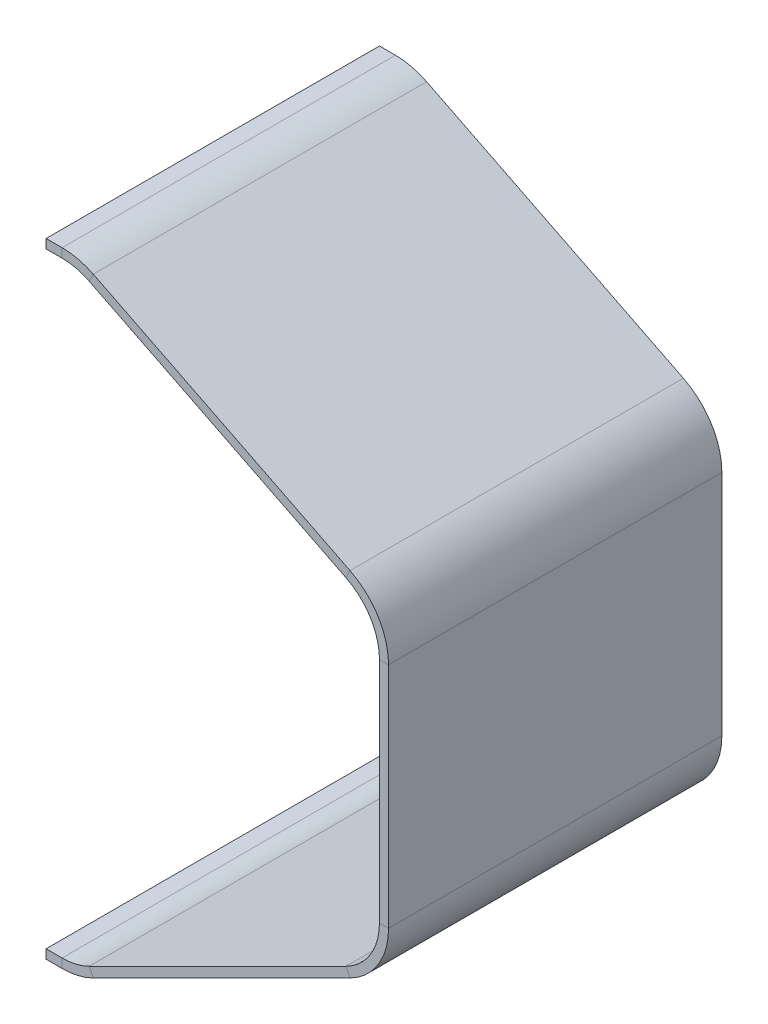
ISO-10303-21;
HEADER;
FILE_DESCRIPTION(('STEP AP214'),'2;1');
FILE_NAME('part.step','',(''),(''),'','','');
FILE_SCHEMA(('AUTOMOTIVE_DESIGN { 1 0 10303 214 1 1 1 1 }'));
ENDSEC;
DATA;
#1=APPLICATION_CONTEXT('core data for automotive mechanical design processes');
#2=APPLICATION_PROTOCOL_DEFINITION('international standard','automotive_design',2000,#1);
#3=PRODUCT_CONTEXT('',#1,'mechanical');
#4=PRODUCT('Part','Part','',(#3));
#5=PRODUCT_RELATED_PRODUCT_CATEGORY('part','',(#4));
#6=PRODUCT_DEFINITION_FORMATION('','',#4);
#7=PRODUCT_DEFINITION_CONTEXT('part definition',#1,'design');
#8=PRODUCT_DEFINITION('design','',#6,#7);
#9=PRODUCT_DEFINITION_SHAPE('','',#8);
#10=(LENGTH_UNIT() NAMED_UNIT(*) SI_UNIT(.MILLI.,.METRE.));
#11=(NAMED_UNIT(*) PLANE_ANGLE_UNIT() SI_UNIT($,.RADIAN.));
#12=(NAMED_UNIT(*) SI_UNIT($,.STERADIAN.) SOLID_ANGLE_UNIT());
#13=UNCERTAINTY_MEASURE_WITH_UNIT(LENGTH_MEASURE(1.E-05),#10,'distance_accuracy_value','');
#14=(GEOMETRIC_REPRESENTATION_CONTEXT(3) GLOBAL_UNCERTAINTY_ASSIGNED_CONTEXT((#13)) GLOBAL_UNIT_ASSIGNED_CONTEXT((#10,
#11,#12)) REPRESENTATION_CONTEXT('',''));
#15=CARTESIAN_POINT('',(0.,0.,0.));
#16=DIRECTION('',(0.,0.,1.));
#17=DIRECTION('',(1.,0.,0.));
#18=AXIS2_PLACEMENT_3D('',#15,#16,#17);
#19=CARTESIAN_POINT('',(7.11145618000167,-48.9442719099992,55.));
#20=DIRECTION('',(0.,0.,1.));
#21=DIRECTION('',(1.,0.,0.));
#22=AXIS2_PLACEMENT_3D('',#19,#20,#21);
#23=PLANE('',#22);
#24=DIRECTION('',(0.447213595499949,-0.89442719099992,0.));
#25=VECTOR('',#24,1.);
#26=CARTESIAN_POINT('',(7.11145618000167,-48.9442719099992,55.));
#27=LINE('',#26,#25);
#28=CARTESIAN_POINT('',(7.11145618000167,-48.9442719099992,55.));
#29=VERTEX_POINT('',#28);
#30=CARTESIAN_POINT('',(7.7822765732516,-50.285912696499,55.));
#31=VERTEX_POINT('',#30);
#32=EDGE_CURVE('E11',#29,#31,#27,.T.);
#33=ORIENTED_EDGE('',*,*,#32,.F.);
#34=CARTESIAN_POINT('',(2.63932022500209,-40.,55.));
#35=DIRECTION('',(0.,0.,1.));
#36=DIRECTION('',(1.,0.,0.));
#37=AXIS2_PLACEMENT_3D('',#34,#35,#36);
#38=CIRCLE('',#37,10.);
#39=CARTESIAN_POINT('',(2.63932022500209,-50.,55.));
#40=VERTEX_POINT('',#39);
#41=EDGE_CURVE('E363',#40,#29,#38,.T.);
#42=ORIENTED_EDGE('',*,*,#41,.F.);
#43=DIRECTION('',(0.,1.,0.));
#44=VECTOR('',#43,1.);
#45=CARTESIAN_POINT('',(2.63932022500208,-51.5,55.));
#46=LINE('',#45,#44);
#47=CARTESIAN_POINT('',(2.63932022500208,-51.5,55.));
#48=VERTEX_POINT('',#47);
#49=EDGE_CURVE('E42',#48,#40,#46,.T.);
#50=ORIENTED_EDGE('',*,*,#49,.F.);
#51=CARTESIAN_POINT('',(2.63932022500209,-40.,55.));
#52=DIRECTION('',(0.,0.,1.));
#53=DIRECTION('',(1.,0.,0.));
#54=AXIS2_PLACEMENT_3D('',#51,#52,#53);
#55=CIRCLE('',#54,11.5);
#56=EDGE_CURVE('E376',#48,#31,#55,.T.);
#57=ORIENTED_EDGE('',*,*,#56,.T.);
#58=EDGE_LOOP('',(#33,#42,#50,#57));
#59=FACE_BOUND('',#58,.T.);
#60=ADVANCED_FACE('F34',(#59),#23,.T.);
#61=CARTESIAN_POINT('',(2.63932022500208,-51.5,55.));
#62=DIRECTION('',(0.,0.,1.));
#63=DIRECTION('',(1.,0.,0.));
#64=AXIS2_PLACEMENT_3D('',#61,#62,#63);
#65=PLANE('',#64);
#66=DIRECTION('',(0.894427190999916,0.447213595499958,0.));
#67=VECTOR('',#66,1.);
#68=CARTESIAN_POINT('',(49.4721359549996,-27.7639320225002,55.));
#69=LINE('',#68,#67);
#70=CARTESIAN_POINT('',(49.4721359549996,-27.7639320225002,55.));
#71=VERTEX_POINT('',#70);
#72=EDGE_CURVE('E367',#29,#71,#69,.T.);
#73=ORIENTED_EDGE('',*,*,#72,.F.);
#74=ORIENTED_EDGE('',*,*,#32,.T.);
#75=DIRECTION('',(0.894427190999916,0.447213595499958,0.));
#76=VECTOR('',#75,1.);
#77=CARTESIAN_POINT('',(50.1429563482495,-29.1055728090001,55.));
#78=LINE('',#77,#76);
#79=CARTESIAN_POINT('',(50.1429563482495,-29.1055728090001,55.));
#80=VERTEX_POINT('',#79);
#81=EDGE_CURVE('E378',#31,#80,#78,.T.);
#82=ORIENTED_EDGE('',*,*,#81,.T.);
#83=DIRECTION('',(-0.447213595499956,0.894427190999917,0.));
#84=VECTOR('',#83,1.);
#85=CARTESIAN_POINT('',(50.1429563482495,-29.1055728090001,55.));
#86=LINE('',#85,#84);
#87=EDGE_CURVE('E337',#80,#71,#86,.T.);
#88=ORIENTED_EDGE('',*,*,#87,.T.);
#89=EDGE_LOOP('',(#73,#74,#82,#88));
#90=FACE_BOUND('',#89,.T.);
#91=ADVANCED_FACE('F447',(#90),#65,.T.);
#92=CARTESIAN_POINT('',(2.63932022500209,-50.,0.));
#93=DIRECTION('',(0.,0.,-1.));
#94=DIRECTION('',(-1.,0.,0.));
#95=AXIS2_PLACEMENT_3D('',#92,#93,#94);
#96=PLANE('',#95);
#97=DIRECTION('',(0.,-1.,0.));
#98=VECTOR('',#97,1.);
#99=CARTESIAN_POINT('',(2.63932022500209,-50.,0.));
#100=LINE('',#99,#98);
#101=CARTESIAN_POINT('',(2.63932022500209,-50.,0.));
#102=VERTEX_POINT('',#101);
#103=CARTESIAN_POINT('',(2.63932022500208,-51.5,0.));
#104=VERTEX_POINT('',#103);
#105=EDGE_CURVE('E343',#102,#104,#100,.T.);
#106=ORIENTED_EDGE('',*,*,#105,.F.);
#107=CARTESIAN_POINT('',(2.63932022500209,-40.,0.));
#108=DIRECTION('',(0.,0.,1.));
#109=DIRECTION('',(1.,0.,0.));
#110=AXIS2_PLACEMENT_3D('',#107,#108,#109);
#111=CIRCLE('',#110,10.);
#112=CARTESIAN_POINT('',(7.11145618000167,-48.9442719099992,0.));
#113=VERTEX_POINT('',#112);
#114=EDGE_CURVE('E247',#102,#113,#111,.T.);
#115=ORIENTED_EDGE('',*,*,#114,.T.);
#116=DIRECTION('',(-0.447213595499949,0.89442719099992,0.));
#117=VECTOR('',#116,1.);
#118=CARTESIAN_POINT('',(7.7822765732516,-50.285912696499,0.));
#119=LINE('',#118,#117);
#120=CARTESIAN_POINT('',(7.7822765732516,-50.285912696499,0.));
#121=VERTEX_POINT('',#120);
#122=EDGE_CURVE('E341',#121,#113,#119,.T.);
#123=ORIENTED_EDGE('',*,*,#122,.F.);
#124=CARTESIAN_POINT('',(2.63932022500209,-40.,0.));
#125=DIRECTION('',(0.,0.,1.));
#126=DIRECTION('',(1.,0.,0.));
#127=AXIS2_PLACEMENT_3D('',#124,#125,#126);
#128=CIRCLE('',#127,11.5);
#129=EDGE_CURVE('E259',#104,#121,#128,.T.);
#130=ORIENTED_EDGE('',*,*,#129,.F.);
#131=EDGE_LOOP('',(#106,#115,#123,#130));
#132=FACE_BOUND('',#131,.T.);
#133=ADVANCED_FACE('F489',(#132),#96,.T.);
#134=CARTESIAN_POINT('',(7.7822765732516,-50.285912696499,0.));
#135=DIRECTION('',(0.,0.,-1.));
#136=DIRECTION('',(-1.,0.,0.));
#137=AXIS2_PLACEMENT_3D('',#134,#135,#136);
#138=PLANE('',#137);
#139=DIRECTION('',(1.,0.,0.));
#140=VECTOR('',#139,1.);
#141=CARTESIAN_POINT('',(2.63932022500209,-50.,0.));
#142=LINE('',#141,#140);
#143=CARTESIAN_POINT('',(0.,-50.,0.));
#144=VERTEX_POINT('',#143);
#145=EDGE_CURVE('E250',#144,#102,#142,.T.);
#146=ORIENTED_EDGE('',*,*,#145,.T.);
#147=ORIENTED_EDGE('',*,*,#105,.T.);
#148=DIRECTION('',(1.,0.,0.));
#149=VECTOR('',#148,1.);
#150=CARTESIAN_POINT('',(2.63932022500208,-51.5,0.));
#151=LINE('',#150,#149);
#152=CARTESIAN_POINT('',(0.,-51.5,0.));
#153=VERTEX_POINT('',#152);
#154=EDGE_CURVE('E256',#153,#104,#151,.T.);
#155=ORIENTED_EDGE('',*,*,#154,.F.);
#156=DIRECTION('',(0.,1.,0.));
#157=VECTOR('',#156,1.);
#158=CARTESIAN_POINT('',(0.,-51.5,0.));
#159=LINE('',#158,#157);
#160=EDGE_CURVE('E253',#153,#144,#159,.T.);
#161=ORIENTED_EDGE('',*,*,#160,.T.);
#162=EDGE_LOOP('',(#146,#147,#155,#161));
#163=FACE_BOUND('',#162,.T.);
#164=ADVANCED_FACE('F493',(#163),#138,.T.);
#165=CARTESIAN_POINT('',(55.,-18.819660112501,55.));
#166=DIRECTION('',(0.,0.,1.));
#167=DIRECTION('',(1.,0.,0.));
#168=AXIS2_PLACEMENT_3D('',#165,#166,#167);
#169=PLANE('',#168);
#170=DIRECTION('',(1.,0.,0.));
#171=VECTOR('',#170,1.);
#172=CARTESIAN_POINT('',(55.,-18.819660112501,55.));
#173=LINE('',#172,#171);
#174=CARTESIAN_POINT('',(55.,-18.819660112501,55.));
#175=VERTEX_POINT('',#174);
#176=CARTESIAN_POINT('',(56.5,-18.819660112501,55.));
#177=VERTEX_POINT('',#176);
#178=EDGE_CURVE('E339',#175,#177,#173,.T.);
#179=ORIENTED_EDGE('',*,*,#178,.F.);
#180=CARTESIAN_POINT('',(45.,-18.819660112501,55.));
#181=DIRECTION('',(0.,0.,1.));
#182=DIRECTION('',(1.,0.,0.));
#183=AXIS2_PLACEMENT_3D('',#180,#181,#182);
#184=CIRCLE('',#183,10.);
#185=EDGE_CURVE('E437',#71,#175,#184,.T.);
#186=ORIENTED_EDGE('',*,*,#185,.F.);
#187=ORIENTED_EDGE('',*,*,#87,.F.);
#188=CARTESIAN_POINT('',(45.,-18.819660112501,55.));
#189=DIRECTION('',(0.,0.,1.));
#190=DIRECTION('',(1.,0.,0.));
#191=AXIS2_PLACEMENT_3D('',#188,#189,#190);
#192=CIRCLE('',#191,11.5);
#193=EDGE_CURVE('E381',#80,#177,#192,.T.);
#194=ORIENTED_EDGE('',*,*,#193,.T.);
#195=EDGE_LOOP('',(#179,#186,#187,#194));
#196=FACE_BOUND('',#195,.T.);
#197=ADVANCED_FACE('F454',(#196),#169,.T.);
#198=CARTESIAN_POINT('',(50.1429563482495,-29.1055728090001,55.));
#199=DIRECTION('',(0.,0.,1.));
#200=DIRECTION('',(1.,0.,0.));
#201=AXIS2_PLACEMENT_3D('',#198,#199,#200);
#202=PLANE('',#201);
#203=DIRECTION('',(0.,1.,0.));
#204=VECTOR('',#203,1.);
#205=CARTESIAN_POINT('',(55.,-18.819660112501,55.));
#206=LINE('',#205,#204);
#207=CARTESIAN_POINT('',(55.,18.819660112501,55.));
#208=VERTEX_POINT('',#207);
#209=EDGE_CURVE('E434',#175,#208,#206,.T.);
#210=ORIENTED_EDGE('',*,*,#209,.F.);
#211=ORIENTED_EDGE('',*,*,#178,.T.);
#212=DIRECTION('',(0.,1.,0.));
#213=VECTOR('',#212,1.);
#214=CARTESIAN_POINT('',(56.5,-18.819660112501,55.));
#215=LINE('',#214,#213);
#216=CARTESIAN_POINT('',(56.5,18.819660112501,55.));
#217=VERTEX_POINT('',#216);
#218=EDGE_CURVE('E201',#177,#217,#215,.T.);
#219=ORIENTED_EDGE('',*,*,#218,.T.);
#220=DIRECTION('',(-1.,0.,0.));
#221=VECTOR('',#220,1.);
#222=CARTESIAN_POINT('',(56.5,18.819660112501,55.));
#223=LINE('',#222,#221);
#224=EDGE_CURVE('E192',#217,#208,#223,.T.);
#225=ORIENTED_EDGE('',*,*,#224,.T.);
#226=EDGE_LOOP('',(#210,#211,#219,#225));
#227=FACE_BOUND('',#226,.T.);
#228=ADVANCED_FACE('F387',(#227),#202,.T.);
#229=CARTESIAN_POINT('',(49.4721359549996,-27.7639320225002,0.));
#230=DIRECTION('',(0.,0.,-1.));
#231=DIRECTION('',(-1.,0.,0.));
#232=AXIS2_PLACEMENT_3D('',#229,#230,#231);
#233=PLANE('',#232);
#234=DIRECTION('',(0.447213595499956,-0.894427190999917,0.));
#235=VECTOR('',#234,1.);
#236=CARTESIAN_POINT('',(49.4721359549996,-27.7639320225002,0.));
#237=LINE('',#236,#235);
#238=CARTESIAN_POINT('',(49.4721359549996,-27.7639320225002,0.));
#239=VERTEX_POINT('',#238);
#240=CARTESIAN_POINT('',(50.1429563482495,-29.1055728090001,0.));
#241=VERTEX_POINT('',#240);
#242=EDGE_CURVE('E335',#239,#241,#237,.T.);
#243=ORIENTED_EDGE('',*,*,#242,.F.);
#244=CARTESIAN_POINT('',(45.,-18.819660112501,0.));
#245=DIRECTION('',(0.,0.,1.));
#246=DIRECTION('',(1.,0.,0.));
#247=AXIS2_PLACEMENT_3D('',#244,#245,#246);
#248=CIRCLE('',#247,10.);
#249=CARTESIAN_POINT('',(55.,-18.819660112501,0.));
#250=VERTEX_POINT('',#249);
#251=EDGE_CURVE('E241',#239,#250,#248,.T.);
#252=ORIENTED_EDGE('',*,*,#251,.T.);
#253=DIRECTION('',(-1.,0.,0.));
#254=VECTOR('',#253,1.);
#255=CARTESIAN_POINT('',(56.5,-18.819660112501,0.));
#256=LINE('',#255,#254);
#257=CARTESIAN_POINT('',(56.5,-18.819660112501,0.));
#258=VERTEX_POINT('',#257);
#259=EDGE_CURVE('E191',#258,#250,#256,.T.);
#260=ORIENTED_EDGE('',*,*,#259,.F.);
#261=CARTESIAN_POINT('',(45.,-18.819660112501,0.));
#262=DIRECTION('',(0.,0.,1.));
#263=DIRECTION('',(1.,0.,0.));
#264=AXIS2_PLACEMENT_3D('',#261,#262,#263);
#265=CIRCLE('',#264,11.5);
#266=EDGE_CURVE('E265',#241,#258,#265,.T.);
#267=ORIENTED_EDGE('',*,*,#266,.F.);
#268=EDGE_LOOP('',(#243,#252,#260,#267));
#269=FACE_BOUND('',#268,.T.);
#270=ADVANCED_FACE('F463',(#269),#233,.T.);
#271=CARTESIAN_POINT('',(56.5,-18.819660112501,0.));
#272=DIRECTION('',(0.,0.,-1.));
#273=DIRECTION('',(-1.,0.,0.));
#274=AXIS2_PLACEMENT_3D('',#271,#272,#273);
#275=PLANE('',#274);
#276=DIRECTION('',(0.894427190999916,0.447213595499958,0.));
#277=VECTOR('',#276,1.);
#278=CARTESIAN_POINT('',(49.4721359549996,-27.7639320225002,0.));
#279=LINE('',#278,#277);
#280=EDGE_CURVE('E244',#113,#239,#279,.T.);
#281=ORIENTED_EDGE('',*,*,#280,.T.);
#282=ORIENTED_EDGE('',*,*,#242,.T.);
#283=DIRECTION('',(0.894427190999916,0.447213595499958,0.));
#284=VECTOR('',#283,1.);
#285=CARTESIAN_POINT('',(50.1429563482495,-29.1055728090001,0.));
#286=LINE('',#285,#284);
#287=EDGE_CURVE('E262',#121,#241,#286,.T.);
#288=ORIENTED_EDGE('',*,*,#287,.F.);
#289=ORIENTED_EDGE('',*,*,#122,.T.);
#290=EDGE_LOOP('',(#281,#282,#288,#289));
#291=FACE_BOUND('',#290,.T.);
#292=ADVANCED_FACE('F467',(#291),#275,.T.);
#293=CARTESIAN_POINT('',(49.4721359549996,27.7639320225002,55.));
#294=DIRECTION('',(0.,0.,1.));
#295=DIRECTION('',(1.,0.,0.));
#296=AXIS2_PLACEMENT_3D('',#293,#294,#295);
#297=PLANE('',#296);
#298=DIRECTION('',(0.447213595499958,0.894427190999916,0.));
#299=VECTOR('',#298,1.);
#300=CARTESIAN_POINT('',(49.4721359549996,27.7639320225002,55.));
#301=LINE('',#300,#299);
#302=CARTESIAN_POINT('',(49.4721359549996,27.7639320225002,55.));
#303=VERTEX_POINT('',#302);
#304=CARTESIAN_POINT('',(50.1429563482495,29.1055728090001,55.));
#305=VERTEX_POINT('',#304);
#306=EDGE_CURVE('E179',#303,#305,#301,.T.);
#307=ORIENTED_EDGE('',*,*,#306,.F.);
#308=CARTESIAN_POINT('',(45.,18.819660112501,55.));
#309=DIRECTION('',(0.,0.,1.));
#310=DIRECTION('',(1.,0.,0.));
#311=AXIS2_PLACEMENT_3D('',#308,#309,#310);
#312=CIRCLE('',#311,10.);
#313=EDGE_CURVE('E399',#208,#303,#312,.T.);
#314=ORIENTED_EDGE('',*,*,#313,.F.);
#315=ORIENTED_EDGE('',*,*,#224,.F.);
#316=CARTESIAN_POINT('',(45.,18.819660112501,55.));
#317=DIRECTION('',(0.,0.,1.));
#318=DIRECTION('',(1.,0.,0.));
#319=AXIS2_PLACEMENT_3D('',#316,#317,#318);
#320=CIRCLE('',#319,11.5);
#321=EDGE_CURVE('E195',#217,#305,#320,.T.);
#322=ORIENTED_EDGE('',*,*,#321,.T.);
#323=EDGE_LOOP('',(#307,#314,#315,#322));
#324=FACE_BOUND('',#323,.T.);
#325=ADVANCED_FACE('F197',(#324),#297,.T.);
#326=CARTESIAN_POINT('',(56.5,18.819660112501,55.));
#327=DIRECTION('',(0.,0.,1.));
#328=DIRECTION('',(1.,0.,0.));
#329=AXIS2_PLACEMENT_3D('',#326,#327,#328);
#330=PLANE('',#329);
#331=DIRECTION('',(-0.894427190999916,0.447213595499958,0.));
#332=VECTOR('',#331,1.);
#333=CARTESIAN_POINT('',(49.4721359549996,27.7639320225002,55.));
#334=LINE('',#333,#332);
#335=CARTESIAN_POINT('',(7.11145618000167,48.9442719099992,55.));
#336=VERTEX_POINT('',#335);
#337=EDGE_CURVE('E186',#303,#336,#334,.T.);
#338=ORIENTED_EDGE('',*,*,#337,.F.);
#339=ORIENTED_EDGE('',*,*,#306,.T.);
#340=DIRECTION('',(-0.894427190999916,0.447213595499958,0.));
#341=VECTOR('',#340,1.);
#342=CARTESIAN_POINT('',(50.1429563482495,29.1055728090001,55.));
#343=LINE('',#342,#341);
#344=CARTESIAN_POINT('',(7.78227657325161,50.285912696499,55.));
#345=VERTEX_POINT('',#344);
#346=EDGE_CURVE('E183',#305,#345,#343,.T.);
#347=ORIENTED_EDGE('',*,*,#346,.T.);
#348=DIRECTION('',(-0.447213595499958,-0.894427190999916,0.));
#349=VECTOR('',#348,1.);
#350=CARTESIAN_POINT('',(7.78227657325161,50.285912696499,55.));
#351=LINE('',#350,#349);
#352=EDGE_CURVE('E326',#345,#336,#351,.T.);
#353=ORIENTED_EDGE('',*,*,#352,.T.);
#354=EDGE_LOOP('',(#338,#339,#347,#353));
#355=FACE_BOUND('',#354,.T.);
#356=ADVANCED_FACE('F181',(#355),#330,.T.);
#357=CARTESIAN_POINT('',(55.,18.819660112501,0.));
#358=DIRECTION('',(0.,0.,-1.));
#359=DIRECTION('',(-1.,0.,0.));
#360=AXIS2_PLACEMENT_3D('',#357,#358,#359);
#361=PLANE('',#360);
#362=DIRECTION('',(1.,0.,0.));
#363=VECTOR('',#362,1.);
#364=CARTESIAN_POINT('',(55.,18.819660112501,0.));
#365=LINE('',#364,#363);
#366=CARTESIAN_POINT('',(55.,18.819660112501,0.));
#367=VERTEX_POINT('',#366);
#368=CARTESIAN_POINT('',(56.5,18.819660112501,0.));
#369=VERTEX_POINT('',#368);
#370=EDGE_CURVE('E331',#367,#369,#365,.T.);
#371=ORIENTED_EDGE('',*,*,#370,.F.);
#372=CARTESIAN_POINT('',(45.,18.819660112501,0.));
#373=DIRECTION('',(0.,0.,1.));
#374=DIRECTION('',(1.,0.,0.));
#375=AXIS2_PLACEMENT_3D('',#372,#373,#374);
#376=CIRCLE('',#375,10.);
#377=CARTESIAN_POINT('',(49.4721359549996,27.7639320225002,0.));
#378=VERTEX_POINT('',#377);
#379=EDGE_CURVE('E235',#367,#378,#376,.T.);
#380=ORIENTED_EDGE('',*,*,#379,.T.);
#381=DIRECTION('',(-0.447213595499958,-0.894427190999916,0.));
#382=VECTOR('',#381,1.);
#383=CARTESIAN_POINT('',(50.1429563482495,29.1055728090001,0.));
#384=LINE('',#383,#382);
#385=CARTESIAN_POINT('',(50.1429563482495,29.1055728090001,0.));
#386=VERTEX_POINT('',#385);
#387=EDGE_CURVE('E329',#386,#378,#384,.T.);
#388=ORIENTED_EDGE('',*,*,#387,.F.);
#389=CARTESIAN_POINT('',(45.,18.819660112501,0.));
#390=DIRECTION('',(0.,0.,1.));
#391=DIRECTION('',(1.,0.,0.));
#392=AXIS2_PLACEMENT_3D('',#389,#390,#391);
#393=CIRCLE('',#392,11.5);
#394=EDGE_CURVE('E208',#369,#386,#393,.T.);
#395=ORIENTED_EDGE('',*,*,#394,.F.);
#396=EDGE_LOOP('',(#371,#380,#388,#395));
#397=FACE_BOUND('',#396,.T.);
#398=ADVANCED_FACE('F393',(#397),#361,.T.);
#399=CARTESIAN_POINT('',(50.1429563482495,29.1055728090001,0.));
#400=DIRECTION('',(0.,0.,-1.));
#401=DIRECTION('',(-1.,0.,0.));
#402=AXIS2_PLACEMENT_3D('',#399,#400,#401);
#403=PLANE('',#402);
#404=DIRECTION('',(0.,1.,0.));
#405=VECTOR('',#404,1.);
#406=CARTESIAN_POINT('',(55.,-18.819660112501,0.));
#407=LINE('',#406,#405);
#408=EDGE_CURVE('E238',#250,#367,#407,.T.);
#409=ORIENTED_EDGE('',*,*,#408,.T.);
#410=ORIENTED_EDGE('',*,*,#370,.T.);
#411=DIRECTION('',(0.,1.,0.));
#412=VECTOR('',#411,1.);
#413=CARTESIAN_POINT('',(56.5,-18.819660112501,0.));
#414=LINE('',#413,#412);
#415=EDGE_CURVE('E268',#258,#369,#414,.T.);
#416=ORIENTED_EDGE('',*,*,#415,.F.);
#417=ORIENTED_EDGE('',*,*,#259,.T.);
#418=EDGE_LOOP('',(#409,#410,#416,#417));
#419=FACE_BOUND('',#418,.T.);
#420=ADVANCED_FACE('F473',(#419),#403,.T.);
#421=CARTESIAN_POINT('',(2.63932022500209,50.,55.));
#422=DIRECTION('',(0.,0.,1.));
#423=DIRECTION('',(1.,0.,0.));
#424=AXIS2_PLACEMENT_3D('',#421,#422,#423);
#425=PLANE('',#424);
#426=DIRECTION('',(0.,1.,0.));
#427=VECTOR('',#426,1.);
#428=CARTESIAN_POINT('',(2.63932022500209,50.,55.));
#429=LINE('',#428,#427);
#430=CARTESIAN_POINT('',(2.63932022500209,50.,55.));
#431=VERTEX_POINT('',#430);
#432=CARTESIAN_POINT('',(2.63932022500208,51.5,55.));
#433=VERTEX_POINT('',#432);
#434=EDGE_CURVE('E50',#431,#433,#429,.T.);
#435=ORIENTED_EDGE('',*,*,#434,.F.);
#436=CARTESIAN_POINT('',(2.63932022500209,40.,55.));
#437=DIRECTION('',(0.,0.,1.));
#438=DIRECTION('',(1.,0.,0.));
#439=AXIS2_PLACEMENT_3D('',#436,#437,#438);
#440=CIRCLE('',#439,10.);
#441=EDGE_CURVE('E427',#336,#431,#440,.T.);
#442=ORIENTED_EDGE('',*,*,#441,.F.);
#443=ORIENTED_EDGE('',*,*,#352,.F.);
#444=CARTESIAN_POINT('',(2.63932022500209,40.,55.));
#445=DIRECTION('',(0.,0.,1.));
#446=DIRECTION('',(1.,0.,0.));
#447=AXIS2_PLACEMENT_3D('',#444,#445,#446);
#448=CIRCLE('',#447,11.5);
#449=EDGE_CURVE('E216',#345,#433,#448,.T.);
#450=ORIENTED_EDGE('',*,*,#449,.T.);
#451=EDGE_LOOP('',(#435,#442,#443,#450));
#452=FACE_BOUND('',#451,.T.);
#453=ADVANCED_FACE('F475',(#452),#425,.T.);
#454=CARTESIAN_POINT('',(7.78227657325161,50.285912696499,55.));
#455=DIRECTION('',(0.,0.,1.));
#456=DIRECTION('',(1.,0.,0.));
#457=AXIS2_PLACEMENT_3D('',#454,#455,#456);
#458=PLANE('',#457);
#459=DIRECTION('',(-1.,0.,0.));
#460=VECTOR('',#459,1.);
#461=CARTESIAN_POINT('',(2.63932022500209,50.,55.));
#462=LINE('',#461,#460);
#463=CARTESIAN_POINT('',(0.,50.,55.));
#464=VERTEX_POINT('',#463);
#465=EDGE_CURVE('E425',#431,#464,#462,.T.);
#466=ORIENTED_EDGE('',*,*,#465,.F.);
#467=ORIENTED_EDGE('',*,*,#434,.T.);
#468=DIRECTION('',(-1.,0.,0.));
#469=VECTOR('',#468,1.);
#470=CARTESIAN_POINT('',(2.63932022500208,51.5,55.));
#471=LINE('',#470,#469);
#472=CARTESIAN_POINT('',(0.,51.5,55.));
#473=VERTEX_POINT('',#472);
#474=EDGE_CURVE('E128',#433,#473,#471,.T.);
#475=ORIENTED_EDGE('',*,*,#474,.T.);
#476=DIRECTION('',(0.,1.,0.));
#477=VECTOR('',#476,1.);
#478=CARTESIAN_POINT('',(0.,50.,55.));
#479=LINE('',#478,#477);
#480=EDGE_CURVE('E423',#464,#473,#479,.T.);
#481=ORIENTED_EDGE('',*,*,#480,.F.);
#482=EDGE_LOOP('',(#466,#467,#475,#481));
#483=FACE_BOUND('',#482,.T.);
#484=ADVANCED_FACE('F481',(#483),#458,.T.);
#485=CARTESIAN_POINT('',(7.11145618000167,48.9442719099992,0.));
#486=DIRECTION('',(0.,0.,-1.));
#487=DIRECTION('',(-1.,0.,0.));
#488=AXIS2_PLACEMENT_3D('',#485,#486,#487);
#489=PLANE('',#488);
#490=DIRECTION('',(0.447213595499958,0.894427190999916,0.));
#491=VECTOR('',#490,1.);
#492=CARTESIAN_POINT('',(7.11145618000167,48.9442719099992,0.));
#493=LINE('',#492,#491);
#494=CARTESIAN_POINT('',(7.11145618000167,48.9442719099992,0.));
#495=VERTEX_POINT('',#494);
#496=CARTESIAN_POINT('',(7.78227657325161,50.285912696499,0.));
#497=VERTEX_POINT('',#496);
#498=EDGE_CURVE('E115',#495,#497,#493,.T.);
#499=ORIENTED_EDGE('',*,*,#498,.F.);
#500=CARTESIAN_POINT('',(2.63932022500209,40.,0.));
#501=DIRECTION('',(0.,0.,1.));
#502=DIRECTION('',(1.,0.,0.));
#503=AXIS2_PLACEMENT_3D('',#500,#501,#502);
#504=CIRCLE('',#503,10.);
#505=CARTESIAN_POINT('',(2.63932022500209,50.,0.));
#506=VERTEX_POINT('',#505);
#507=EDGE_CURVE('E231',#495,#506,#504,.T.);
#508=ORIENTED_EDGE('',*,*,#507,.T.);
#509=DIRECTION('',(0.,-1.,0.));
#510=VECTOR('',#509,1.);
#511=CARTESIAN_POINT('',(2.63932022500208,51.5,0.));
#512=LINE('',#511,#510);
#513=CARTESIAN_POINT('',(2.63932022500208,51.5,0.));
#514=VERTEX_POINT('',#513);
#515=EDGE_CURVE('E122',#514,#506,#512,.T.);
#516=ORIENTED_EDGE('',*,*,#515,.F.);
#517=CARTESIAN_POINT('',(2.63932022500209,40.,0.));
#518=DIRECTION('',(0.,0.,1.));
#519=DIRECTION('',(1.,0.,0.));
#520=AXIS2_PLACEMENT_3D('',#517,#518,#519);
#521=CIRCLE('',#520,11.5);
#522=EDGE_CURVE('E274',#497,#514,#521,.T.);
#523=ORIENTED_EDGE('',*,*,#522,.F.);
#524=EDGE_LOOP('',(#499,#508,#516,#523));
#525=FACE_BOUND('',#524,.T.);
#526=ADVANCED_FACE('F410',(#525),#489,.T.);
#527=CARTESIAN_POINT('',(2.63932022500208,51.5,0.));
#528=DIRECTION('',(0.,0.,-1.));
#529=DIRECTION('',(-1.,0.,0.));
#530=AXIS2_PLACEMENT_3D('',#527,#528,#529);
#531=PLANE('',#530);
#532=DIRECTION('',(-0.894427190999916,0.447213595499958,0.));
#533=VECTOR('',#532,1.);
#534=CARTESIAN_POINT('',(49.4721359549996,27.7639320225002,0.));
#535=LINE('',#534,#533);
#536=EDGE_CURVE('E233',#378,#495,#535,.T.);
#537=ORIENTED_EDGE('',*,*,#536,.T.);
#538=ORIENTED_EDGE('',*,*,#498,.T.);
#539=DIRECTION('',(-0.894427190999916,0.447213595499958,0.));
#540=VECTOR('',#539,1.);
#541=CARTESIAN_POINT('',(50.1429563482495,29.1055728090001,0.));
#542=LINE('',#541,#540);
#543=EDGE_CURVE('E272',#386,#497,#542,.T.);
#544=ORIENTED_EDGE('',*,*,#543,.F.);
#545=ORIENTED_EDGE('',*,*,#387,.T.);
#546=EDGE_LOOP('',(#537,#538,#544,#545));
#547=FACE_BOUND('',#546,.T.);
#548=ADVANCED_FACE('F395',(#547),#531,.T.);
#549=CARTESIAN_POINT('',(2.63932022500208,51.5,55.));
#550=DIRECTION('',(0.,-1.,0.));
#551=DIRECTION('',(1.,0.,0.));
#552=AXIS2_PLACEMENT_3D('',#549,#550,#551);
#553=PLANE('',#552);
#554=DIRECTION('',(-1.,0.,0.));
#555=VECTOR('',#554,1.);
#556=CARTESIAN_POINT('',(2.63932022500208,51.5,0.));
#557=LINE('',#556,#555);
#558=CARTESIAN_POINT('',(0.,51.5,0.));
#559=VERTEX_POINT('',#558);
#560=EDGE_CURVE('E222',#514,#559,#557,.T.);
#561=ORIENTED_EDGE('',*,*,#560,.T.);
#562=DIRECTION('',(0.,0.,-1.));
#563=VECTOR('',#562,1.);
#564=CARTESIAN_POINT('',(0.,51.5,55.));
#565=LINE('',#564,#563);
#566=EDGE_CURVE('E322',#473,#559,#565,.T.);
#567=ORIENTED_EDGE('',*,*,#566,.F.);
#568=ORIENTED_EDGE('',*,*,#474,.F.);
#569=DIRECTION('',(0.,0.,-1.));
#570=VECTOR('',#569,1.);
#571=CARTESIAN_POINT('',(2.63932022500208,51.5,55.));
#572=LINE('',#571,#570);
#573=EDGE_CURVE('E218',#433,#514,#572,.T.);
#574=ORIENTED_EDGE('',*,*,#573,.T.);
#575=EDGE_LOOP('',(#561,#567,#568,#574));
#576=FACE_BOUND('',#575,.T.);
#577=ADVANCED_FACE('F416',(#576),#553,.F.);
#578=CARTESIAN_POINT('',(0.,50.,55.));
#579=DIRECTION('',(-1.,0.,0.));
#580=DIRECTION('',(0.,-1.,0.));
#581=AXIS2_PLACEMENT_3D('',#578,#579,#580);
#582=PLANE('',#581);
#583=DIRECTION('',(0.,1.,0.));
#584=VECTOR('',#583,1.);
#585=CARTESIAN_POINT('',(0.,50.,0.));
#586=LINE('',#585,#584);
#587=CARTESIAN_POINT('',(0.,50.,0.));
#588=VERTEX_POINT('',#587);
#589=EDGE_CURVE('E225',#588,#559,#586,.T.);
#590=ORIENTED_EDGE('',*,*,#589,.F.);
#591=DIRECTION('',(0.,0.,-1.));
#592=VECTOR('',#591,1.);
#593=CARTESIAN_POINT('',(0.,50.,55.));
#594=LINE('',#593,#592);
#595=EDGE_CURVE('E320',#464,#588,#594,.T.);
#596=ORIENTED_EDGE('',*,*,#595,.F.);
#597=ORIENTED_EDGE('',*,*,#480,.T.);
#598=ORIENTED_EDGE('',*,*,#566,.T.);
#599=EDGE_LOOP('',(#590,#596,#597,#598));
#600=FACE_BOUND('',#599,.T.);
#601=ADVANCED_FACE('F421',(#600),#582,.T.);
#602=CARTESIAN_POINT('',(2.63932022500209,50.,55.));
#603=DIRECTION('',(0.,-1.,0.));
#604=DIRECTION('',(1.,0.,0.));
#605=AXIS2_PLACEMENT_3D('',#602,#603,#604);
#606=PLANE('',#605);
#607=DIRECTION('',(-1.,0.,0.));
#608=VECTOR('',#607,1.);
#609=CARTESIAN_POINT('',(2.63932022500209,50.,0.));
#610=LINE('',#609,#608);
#611=EDGE_CURVE('E228',#506,#588,#610,.T.);
#612=ORIENTED_EDGE('',*,*,#611,.F.);
#613=DIRECTION('',(0.,0.,-1.));
#614=VECTOR('',#613,1.);
#615=CARTESIAN_POINT('',(2.63932022500209,50.,55.));
#616=LINE('',#615,#614);
#617=EDGE_CURVE('E317',#431,#506,#616,.T.);
#618=ORIENTED_EDGE('',*,*,#617,.F.);
#619=ORIENTED_EDGE('',*,*,#465,.T.);
#620=ORIENTED_EDGE('',*,*,#595,.T.);
#621=EDGE_LOOP('',(#612,#618,#619,#620));
#622=FACE_BOUND('',#621,.T.);
#623=ADVANCED_FACE('F577',(#622),#606,.T.);
#624=CARTESIAN_POINT('',(2.63932022500209,40.,55.));
#625=DIRECTION('',(0.,0.,-1.));
#626=DIRECTION('',(-1.,0.,0.));
#627=AXIS2_PLACEMENT_3D('',#624,#625,#626);
#628=CYLINDRICAL_SURFACE('',#627,10.);
#629=ORIENTED_EDGE('',*,*,#507,.F.);
#630=DIRECTION('',(0.,0.,-1.));
#631=VECTOR('',#630,1.);
#632=CARTESIAN_POINT('',(7.11145618000167,48.9442719099992,55.));
#633=LINE('',#632,#631);
#634=EDGE_CURVE('E314',#336,#495,#633,.T.);
#635=ORIENTED_EDGE('',*,*,#634,.F.);
#636=ORIENTED_EDGE('',*,*,#441,.T.);
#637=ORIENTED_EDGE('',*,*,#617,.T.);
#638=EDGE_LOOP('',(#629,#635,#636,#637));
#639=FACE_BOUND('',#638,.T.);
#640=ADVANCED_FACE('F407',(#639),#628,.F.);
#641=CARTESIAN_POINT('',(49.4721359549996,27.7639320225002,55.));
#642=DIRECTION('',(-0.447213595499958,-0.894427190999916,0.));
#643=DIRECTION('',(0.894427190999916,-0.447213595499958,0.));
#644=AXIS2_PLACEMENT_3D('',#641,#642,#643);
#645=PLANE('',#644);
#646=ORIENTED_EDGE('',*,*,#536,.F.);
#647=DIRECTION('',(0.,0.,-1.));
#648=VECTOR('',#647,1.);
#649=CARTESIAN_POINT('',(49.4721359549996,27.7639320225002,55.));
#650=LINE('',#649,#648);
#651=EDGE_CURVE('E311',#303,#378,#650,.T.);
#652=ORIENTED_EDGE('',*,*,#651,.F.);
#653=ORIENTED_EDGE('',*,*,#337,.T.);
#654=ORIENTED_EDGE('',*,*,#634,.T.);
#655=EDGE_LOOP('',(#646,#652,#653,#654));
#656=FACE_BOUND('',#655,.T.);
#657=ADVANCED_FACE('F401',(#656),#645,.T.);
#658=CARTESIAN_POINT('',(45.,18.819660112501,55.));
#659=DIRECTION('',(0.,0.,-1.));
#660=DIRECTION('',(-1.,0.,0.));
#661=AXIS2_PLACEMENT_3D('',#658,#659,#660);
#662=CYLINDRICAL_SURFACE('',#661,10.);
#663=ORIENTED_EDGE('',*,*,#379,.F.);
#664=DIRECTION('',(0.,0.,-1.));
#665=VECTOR('',#664,1.);
#666=CARTESIAN_POINT('',(55.,18.819660112501,55.));
#667=LINE('',#666,#665);
#668=EDGE_CURVE('E308',#208,#367,#667,.T.);
#669=ORIENTED_EDGE('',*,*,#668,.F.);
#670=ORIENTED_EDGE('',*,*,#313,.T.);
#671=ORIENTED_EDGE('',*,*,#651,.T.);
#672=EDGE_LOOP('',(#663,#669,#670,#671));
#673=FACE_BOUND('',#672,.T.);
#674=ADVANCED_FACE('F398',(#673),#662,.F.);
#675=CARTESIAN_POINT('',(55.,-18.819660112501,55.));
#676=DIRECTION('',(-1.,0.,0.));
#677=DIRECTION('',(0.,0.,1.));
#678=AXIS2_PLACEMENT_3D('',#675,#676,#677);
#679=PLANE('',#678);
#680=ORIENTED_EDGE('',*,*,#408,.F.);
#681=DIRECTION('',(0.,0.,-1.));
#682=VECTOR('',#681,1.);
#683=CARTESIAN_POINT('',(55.,-18.819660112501,55.));
#684=LINE('',#683,#682);
#685=EDGE_CURVE('E305',#175,#250,#684,.T.);
#686=ORIENTED_EDGE('',*,*,#685,.F.);
#687=ORIENTED_EDGE('',*,*,#209,.T.);
#688=ORIENTED_EDGE('',*,*,#668,.T.);
#689=EDGE_LOOP('',(#680,#686,#687,#688));
#690=FACE_BOUND('',#689,.T.);
#691=ADVANCED_FACE('F460',(#690),#679,.T.);
#692=CARTESIAN_POINT('',(45.,-18.819660112501,55.));
#693=DIRECTION('',(0.,0.,-1.));
#694=DIRECTION('',(-1.,0.,0.));
#695=AXIS2_PLACEMENT_3D('',#692,#693,#694);
#696=CYLINDRICAL_SURFACE('',#695,10.);
#697=ORIENTED_EDGE('',*,*,#251,.F.);
#698=DIRECTION('',(0.,0.,-1.));
#699=VECTOR('',#698,1.);
#700=CARTESIAN_POINT('',(49.4721359549996,-27.7639320225002,55.));
#701=LINE('',#700,#699);
#702=EDGE_CURVE('E302',#71,#239,#701,.T.);
#703=ORIENTED_EDGE('',*,*,#702,.F.);
#704=ORIENTED_EDGE('',*,*,#185,.T.);
#705=ORIENTED_EDGE('',*,*,#685,.T.);
#706=EDGE_LOOP('',(#697,#703,#704,#705));
#707=FACE_BOUND('',#706,.T.);
#708=ADVANCED_FACE('F453',(#707),#696,.F.);
#709=CARTESIAN_POINT('',(49.4721359549996,-27.7639320225002,55.));
#710=DIRECTION('',(-0.447213595499958,0.894427190999916,0.));
#711=DIRECTION('',(-0.894427190999916,-0.447213595499958,0.));
#712=AXIS2_PLACEMENT_3D('',#709,#710,#711);
#713=PLANE('',#712);
#714=ORIENTED_EDGE('',*,*,#280,.F.);
#715=DIRECTION('',(0.,0.,-1.));
#716=VECTOR('',#715,1.);
#717=CARTESIAN_POINT('',(7.11145618000167,-48.9442719099992,55.));
#718=LINE('',#717,#716);
#719=EDGE_CURVE('E299',#29,#113,#718,.T.);
#720=ORIENTED_EDGE('',*,*,#719,.F.);
#721=ORIENTED_EDGE('',*,*,#72,.T.);
#722=ORIENTED_EDGE('',*,*,#702,.T.);
#723=EDGE_LOOP('',(#714,#720,#721,#722));
#724=FACE_BOUND('',#723,.T.);
#725=ADVANCED_FACE('F443',(#724),#713,.T.);
#726=CARTESIAN_POINT('',(2.63932022500209,-40.,55.));
#727=DIRECTION('',(0.,0.,-1.));
#728=DIRECTION('',(-1.,0.,0.));
#729=AXIS2_PLACEMENT_3D('',#726,#727,#728);
#730=CYLINDRICAL_SURFACE('',#729,10.);
#731=ORIENTED_EDGE('',*,*,#114,.F.);
#732=DIRECTION('',(0.,0.,-1.));
#733=VECTOR('',#732,1.);
#734=CARTESIAN_POINT('',(2.63932022500209,-50.,55.));
#735=LINE('',#734,#733);
#736=EDGE_CURVE('E296',#40,#102,#735,.T.);
#737=ORIENTED_EDGE('',*,*,#736,.F.);
#738=ORIENTED_EDGE('',*,*,#41,.T.);
#739=ORIENTED_EDGE('',*,*,#719,.T.);
#740=EDGE_LOOP('',(#731,#737,#738,#739));
#741=FACE_BOUND('',#740,.T.);
#742=ADVANCED_FACE('F362',(#741),#730,.F.);
#743=CARTESIAN_POINT('',(2.63932022500209,-50.,55.));
#744=DIRECTION('',(0.,1.,0.));
#745=DIRECTION('',(-1.,0.,0.));
#746=AXIS2_PLACEMENT_3D('',#743,#744,#745);
#747=PLANE('',#746);
#748=ORIENTED_EDGE('',*,*,#145,.F.);
#749=DIRECTION('',(0.,0.,-1.));
#750=VECTOR('',#749,1.);
#751=CARTESIAN_POINT('',(0.,-50.,55.));
#752=LINE('',#751,#750);
#753=CARTESIAN_POINT('',(0.,-50.,55.));
#754=VERTEX_POINT('',#753);
#755=EDGE_CURVE('E294',#754,#144,#752,.T.);
#756=ORIENTED_EDGE('',*,*,#755,.F.);
#757=DIRECTION('',(1.,0.,0.));
#758=VECTOR('',#757,1.);
#759=CARTESIAN_POINT('',(2.63932022500209,-50.,55.));
#760=LINE('',#759,#758);
#761=EDGE_CURVE('E351',#754,#40,#760,.T.);
#762=ORIENTED_EDGE('',*,*,#761,.T.);
#763=ORIENTED_EDGE('',*,*,#736,.T.);
#764=EDGE_LOOP('',(#748,#756,#762,#763));
#765=FACE_BOUND('',#764,.T.);
#766=ADVANCED_FACE('F369',(#765),#747,.T.);
#767=CARTESIAN_POINT('',(0.,-51.5,55.));
#768=DIRECTION('',(-1.,0.,0.));
#769=DIRECTION('',(0.,-1.,0.));
#770=AXIS2_PLACEMENT_3D('',#767,#768,#769);
#771=PLANE('',#770);
#772=ORIENTED_EDGE('',*,*,#160,.F.);
#773=DIRECTION('',(0.,0.,-1.));
#774=VECTOR('',#773,1.);
#775=CARTESIAN_POINT('',(0.,-51.5,55.));
#776=LINE('',#775,#774);
#777=CARTESIAN_POINT('',(0.,-51.5,55.));
#778=VERTEX_POINT('',#777);
#779=EDGE_CURVE('E292',#778,#153,#776,.T.);
#780=ORIENTED_EDGE('',*,*,#779,.F.);
#781=DIRECTION('',(0.,1.,0.));
#782=VECTOR('',#781,1.);
#783=CARTESIAN_POINT('',(0.,-51.5,55.));
#784=LINE('',#783,#782);
#785=EDGE_CURVE('E370',#778,#754,#784,.T.);
#786=ORIENTED_EDGE('',*,*,#785,.T.);
#787=ORIENTED_EDGE('',*,*,#755,.T.);
#788=EDGE_LOOP('',(#772,#780,#786,#787));
#789=FACE_BOUND('',#788,.T.);
#790=ADVANCED_FACE('F660',(#789),#771,.T.);
#791=CARTESIAN_POINT('',(2.63932022500208,-51.5,55.));
#792=DIRECTION('',(0.,1.,0.));
#793=DIRECTION('',(-1.,0.,0.));
#794=AXIS2_PLACEMENT_3D('',#791,#792,#793);
#795=PLANE('',#794);
#796=ORIENTED_EDGE('',*,*,#154,.T.);
#797=DIRECTION('',(0.,0.,-1.));
#798=VECTOR('',#797,1.);
#799=CARTESIAN_POINT('',(2.63932022500208,-51.5,55.));
#800=LINE('',#799,#798);
#801=EDGE_CURVE('E289',#48,#104,#800,.T.);
#802=ORIENTED_EDGE('',*,*,#801,.F.);
#803=DIRECTION('',(1.,0.,0.));
#804=VECTOR('',#803,1.);
#805=CARTESIAN_POINT('',(2.63932022500208,-51.5,55.));
#806=LINE('',#805,#804);
#807=EDGE_CURVE('E354',#778,#48,#806,.T.);
#808=ORIENTED_EDGE('',*,*,#807,.F.);
#809=ORIENTED_EDGE('',*,*,#779,.T.);
#810=EDGE_LOOP('',(#796,#802,#808,#809));
#811=FACE_BOUND('',#810,.T.);
#812=ADVANCED_FACE('F670',(#811),#795,.F.);
#813=CARTESIAN_POINT('',(2.63932022500209,-40.,55.));
#814=DIRECTION('',(0.,0.,-1.));
#815=DIRECTION('',(-1.,0.,0.));
#816=AXIS2_PLACEMENT_3D('',#813,#814,#815);
#817=CYLINDRICAL_SURFACE('',#816,11.5);
#818=ORIENTED_EDGE('',*,*,#129,.T.);
#819=DIRECTION('',(0.,0.,-1.));
#820=VECTOR('',#819,1.);
#821=CARTESIAN_POINT('',(7.7822765732516,-50.285912696499,55.));
#822=LINE('',#821,#820);
#823=EDGE_CURVE('E286',#31,#121,#822,.T.);
#824=ORIENTED_EDGE('',*,*,#823,.F.);
#825=ORIENTED_EDGE('',*,*,#56,.F.);
#826=ORIENTED_EDGE('',*,*,#801,.T.);
#827=EDGE_LOOP('',(#818,#824,#825,#826));
#828=FACE_BOUND('',#827,.T.);
#829=ADVANCED_FACE('F681',(#828),#817,.T.);
#830=CARTESIAN_POINT('',(50.1429563482495,-29.1055728090001,55.));
#831=DIRECTION('',(-0.447213595499958,0.894427190999916,0.));
#832=DIRECTION('',(-0.894427190999916,-0.447213595499958,0.));
#833=AXIS2_PLACEMENT_3D('',#830,#831,#832);
#834=PLANE('',#833);
#835=ORIENTED_EDGE('',*,*,#287,.T.);
#836=DIRECTION('',(0.,0.,-1.));
#837=VECTOR('',#836,1.);
#838=CARTESIAN_POINT('',(50.1429563482495,-29.1055728090001,55.));
#839=LINE('',#838,#837);
#840=EDGE_CURVE('E283',#80,#241,#839,.T.);
#841=ORIENTED_EDGE('',*,*,#840,.F.);
#842=ORIENTED_EDGE('',*,*,#81,.F.);
#843=ORIENTED_EDGE('',*,*,#823,.T.);
#844=EDGE_LOOP('',(#835,#841,#842,#843));
#845=FACE_BOUND('',#844,.T.);
#846=ADVANCED_FACE('F469',(#845),#834,.F.);
#847=CARTESIAN_POINT('',(45.,-18.819660112501,55.));
#848=DIRECTION('',(0.,0.,-1.));
#849=DIRECTION('',(-1.,0.,0.));
#850=AXIS2_PLACEMENT_3D('',#847,#848,#849);
#851=CYLINDRICAL_SURFACE('',#850,11.5);
#852=ORIENTED_EDGE('',*,*,#266,.T.);
#853=DIRECTION('',(0.,0.,-1.));
#854=VECTOR('',#853,1.);
#855=CARTESIAN_POINT('',(56.5,-18.819660112501,55.));
#856=LINE('',#855,#854);
#857=EDGE_CURVE('E280',#177,#258,#856,.T.);
#858=ORIENTED_EDGE('',*,*,#857,.F.);
#859=ORIENTED_EDGE('',*,*,#193,.F.);
#860=ORIENTED_EDGE('',*,*,#840,.T.);
#861=EDGE_LOOP('',(#852,#858,#859,#860));
#862=FACE_BOUND('',#861,.T.);
#863=ADVANCED_FACE('F472',(#862),#851,.T.);
#864=CARTESIAN_POINT('',(56.5,-18.819660112501,55.));
#865=DIRECTION('',(-1.,0.,0.));
#866=DIRECTION('',(0.,0.,1.));
#867=AXIS2_PLACEMENT_3D('',#864,#865,#866);
#868=PLANE('',#867);
#869=ORIENTED_EDGE('',*,*,#415,.T.);
#870=DIRECTION('',(0.,0.,-1.));
#871=VECTOR('',#870,1.);
#872=CARTESIAN_POINT('',(56.5,18.819660112501,55.));
#873=LINE('',#872,#871);
#874=EDGE_CURVE('E210',#217,#369,#873,.T.);
#875=ORIENTED_EDGE('',*,*,#874,.F.);
#876=ORIENTED_EDGE('',*,*,#218,.F.);
#877=ORIENTED_EDGE('',*,*,#857,.T.);
#878=EDGE_LOOP('',(#869,#875,#876,#877));
#879=FACE_BOUND('',#878,.T.);
#880=ADVANCED_FACE('F390',(#879),#868,.F.);
#881=CARTESIAN_POINT('',(45.,18.819660112501,55.));
#882=DIRECTION('',(0.,0.,-1.));
#883=DIRECTION('',(-1.,0.,0.));
#884=AXIS2_PLACEMENT_3D('',#881,#882,#883);
#885=CYLINDRICAL_SURFACE('',#884,11.5);
#886=ORIENTED_EDGE('',*,*,#394,.T.);
#887=DIRECTION('',(0.,0.,-1.));
#888=VECTOR('',#887,1.);
#889=CARTESIAN_POINT('',(50.1429563482495,29.1055728090001,55.));
#890=LINE('',#889,#888);
#891=EDGE_CURVE('E205',#305,#386,#890,.T.);
#892=ORIENTED_EDGE('',*,*,#891,.F.);
#893=ORIENTED_EDGE('',*,*,#321,.F.);
#894=ORIENTED_EDGE('',*,*,#874,.T.);
#895=EDGE_LOOP('',(#886,#892,#893,#894));
#896=FACE_BOUND('',#895,.T.);
#897=ADVANCED_FACE('F206',(#896),#885,.T.);
#898=CARTESIAN_POINT('',(50.1429563482495,29.1055728090001,55.));
#899=DIRECTION('',(-0.447213595499958,-0.894427190999916,0.));
#900=DIRECTION('',(0.894427190999916,-0.447213595499958,0.));
#901=AXIS2_PLACEMENT_3D('',#898,#899,#900);
#902=PLANE('',#901);
#903=ORIENTED_EDGE('',*,*,#543,.T.);
#904=DIRECTION('',(0.,0.,-1.));
#905=VECTOR('',#904,1.);
#906=CARTESIAN_POINT('',(7.78227657325161,50.285912696499,55.));
#907=LINE('',#906,#905);
#908=EDGE_CURVE('E211',#345,#497,#907,.T.);
#909=ORIENTED_EDGE('',*,*,#908,.F.);
#910=ORIENTED_EDGE('',*,*,#346,.F.);
#911=ORIENTED_EDGE('',*,*,#891,.T.);
#912=EDGE_LOOP('',(#903,#909,#910,#911));
#913=FACE_BOUND('',#912,.T.);
#914=ADVANCED_FACE('F213',(#913),#902,.F.);
#915=CARTESIAN_POINT('',(2.63932022500209,40.,55.));
#916=DIRECTION('',(0.,0.,-1.));
#917=DIRECTION('',(-1.,0.,0.));
#918=AXIS2_PLACEMENT_3D('',#915,#916,#917);
#919=CYLINDRICAL_SURFACE('',#918,11.5);
#920=ORIENTED_EDGE('',*,*,#522,.T.);
#921=ORIENTED_EDGE('',*,*,#573,.F.);
#922=ORIENTED_EDGE('',*,*,#449,.F.);
#923=ORIENTED_EDGE('',*,*,#908,.T.);
#924=EDGE_LOOP('',(#920,#921,#922,#923));
#925=FACE_BOUND('',#924,.T.);
#926=ADVANCED_FACE('F413',(#925),#919,.T.);
#927=CARTESIAN_POINT('',(2.63932022500209,40.,55.));
#928=DIRECTION('',(0.,0.,1.));
#929=DIRECTION('',(1.,0.,0.));
#930=AXIS2_PLACEMENT_3D('',#927,#928,#929);
#931=PLANE('',#930);
#932=ORIENTED_EDGE('',*,*,#807,.T.);
#933=ORIENTED_EDGE('',*,*,#49,.T.);
#934=ORIENTED_EDGE('',*,*,#761,.F.);
#935=ORIENTED_EDGE('',*,*,#785,.F.);
#936=EDGE_LOOP('',(#932,#933,#934,#935));
#937=FACE_BOUND('',#936,.T.);
#938=ADVANCED_FACE('F348',(#937),#931,.T.);
#939=CARTESIAN_POINT('',(2.63932022500209,40.,0.));
#940=DIRECTION('',(0.,0.,1.));
#941=DIRECTION('',(1.,0.,0.));
#942=AXIS2_PLACEMENT_3D('',#939,#940,#941);
#943=PLANE('',#942);
#944=ORIENTED_EDGE('',*,*,#560,.F.);
#945=ORIENTED_EDGE('',*,*,#515,.T.);
#946=ORIENTED_EDGE('',*,*,#611,.T.);
#947=ORIENTED_EDGE('',*,*,#589,.T.);
#948=EDGE_LOOP('',(#944,#945,#946,#947));
#949=FACE_BOUND('',#948,.T.);
#950=ADVANCED_FACE('F418',(#949),#943,.F.);
#951=CLOSED_SHELL('',(#60,#91,#133,#164,#197,#228,#270,#292,#325,#356,#398,#420,#453,#484,#526,
#548,#577,#601,#623,#640,#657,#674,#691,#708,#725,#742,#766,#790,#812,#829,#846,#863,#880,#897,
#914,#926,#938,#950));
#952=MANIFOLD_SOLID_BREP('B2',#951);
#953=ADVANCED_BREP_SHAPE_REPRESENTATION('',(#18,#952),#14);
#954=SHAPE_DEFINITION_REPRESENTATION(#9,#953);
ENDSEC;
END-ISO-10303-21;
